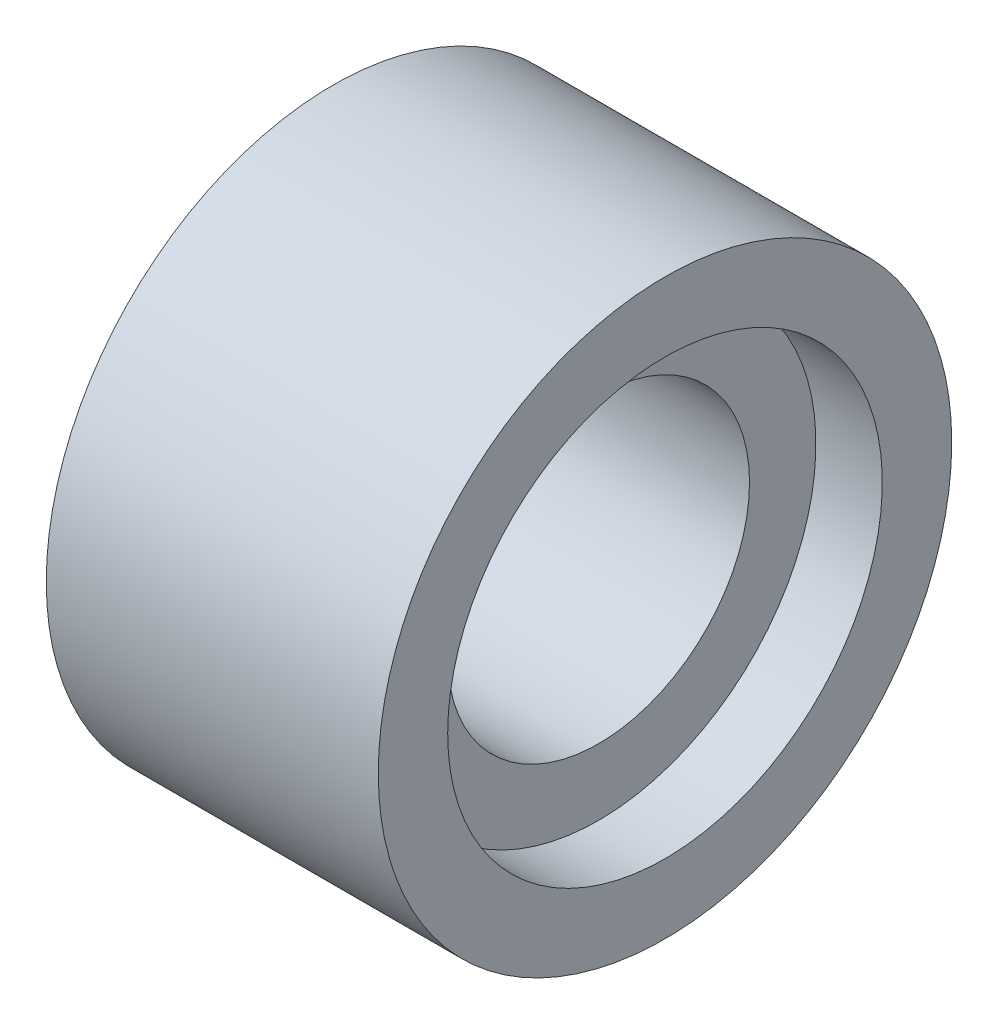
ISO-10303-21;
HEADER;
FILE_DESCRIPTION(('STEP AP214'),'2;1');
FILE_NAME('part.step','',(''),(''),'','','');
FILE_SCHEMA(('AUTOMOTIVE_DESIGN { 1 0 10303 214 1 1 1 1 }'));
ENDSEC;
DATA;
#1=APPLICATION_CONTEXT('core data for automotive mechanical design processes');
#2=APPLICATION_PROTOCOL_DEFINITION('international standard','automotive_design',2000,#1);
#3=PRODUCT_CONTEXT('',#1,'mechanical');
#4=PRODUCT('Part','Part','',(#3));
#5=PRODUCT_RELATED_PRODUCT_CATEGORY('part','',(#4));
#6=PRODUCT_DEFINITION_FORMATION('','',#4);
#7=PRODUCT_DEFINITION_CONTEXT('part definition',#1,'design');
#8=PRODUCT_DEFINITION('design','',#6,#7);
#9=PRODUCT_DEFINITION_SHAPE('','',#8);
#10=(LENGTH_UNIT() NAMED_UNIT(*) SI_UNIT(.MILLI.,.METRE.));
#11=(NAMED_UNIT(*) PLANE_ANGLE_UNIT() SI_UNIT($,.RADIAN.));
#12=(NAMED_UNIT(*) SI_UNIT($,.STERADIAN.) SOLID_ANGLE_UNIT());
#13=UNCERTAINTY_MEASURE_WITH_UNIT(LENGTH_MEASURE(1.E-05),#10,'distance_accuracy_value','');
#14=(GEOMETRIC_REPRESENTATION_CONTEXT(3) GLOBAL_UNCERTAINTY_ASSIGNED_CONTEXT((#13)) GLOBAL_UNIT_ASSIGNED_CONTEXT((#10,
#11,#12)) REPRESENTATION_CONTEXT('',''));
#15=CARTESIAN_POINT('',(0.,0.,0.));
#16=DIRECTION('',(0.,0.,1.));
#17=DIRECTION('',(1.,0.,0.));
#18=AXIS2_PLACEMENT_3D('',#15,#16,#17);
#19=CARTESIAN_POINT('',(-12.5747225647349,0.134147334147333,0.));
#20=DIRECTION('',(-1.,0.,0.));
#21=DIRECTION('',(0.,0.,1.));
#22=AXIS2_PLACEMENT_3D('',#19,#20,#21);
#23=CYLINDRICAL_SURFACE('',#22,9.5);
#24=CARTESIAN_POINT('',(0.,0.134147334147333,0.));
#25=DIRECTION('',(-1.,0.,0.));
#26=DIRECTION('',(0.,0.,1.));
#27=AXIS2_PLACEMENT_3D('',#24,#25,#26);
#28=CIRCLE('',#27,9.5);
#29=CARTESIAN_POINT('',(0.,0.134147334147333,9.5));
#30=VERTEX_POINT('',#29);
#31=EDGE_CURVE('E59',#30,#30,#28,.T.);
#32=ORIENTED_EDGE('',*,*,#31,.F.);
#33=EDGE_LOOP('',(#32));
#34=FACE_BOUND('',#33,.T.);
#35=CARTESIAN_POINT('',(11.,0.134147334147333,0.));
#36=DIRECTION('',(-1.,0.,0.));
#37=DIRECTION('',(0.,0.,1.));
#38=AXIS2_PLACEMENT_3D('',#35,#36,#37);
#39=CIRCLE('',#38,9.5);
#40=CARTESIAN_POINT('',(11.,0.134147334147333,9.5));
#41=VERTEX_POINT('',#40);
#42=EDGE_CURVE('E10',#41,#41,#39,.T.);
#43=ORIENTED_EDGE('',*,*,#42,.T.);
#44=EDGE_LOOP('',(#43));
#45=FACE_BOUND('',#44,.T.);
#46=ADVANCED_FACE('F31',(#34,#45),#23,.T.);
#47=CARTESIAN_POINT('',(11.,9.63414733414733,0.));
#48=DIRECTION('',(-1.,0.,0.));
#49=DIRECTION('',(0.,0.,1.));
#50=AXIS2_PLACEMENT_3D('',#47,#48,#49);
#51=PLANE('',#50);
#52=ORIENTED_EDGE('',*,*,#42,.F.);
#53=EDGE_LOOP('',(#52));
#54=FACE_BOUND('',#53,.T.);
#55=CARTESIAN_POINT('',(11.,0.134147334147333,0.));
#56=DIRECTION('',(-1.,0.,0.));
#57=DIRECTION('',(0.,0.,1.));
#58=AXIS2_PLACEMENT_3D('',#55,#56,#57);
#59=CIRCLE('',#58,7.2);
#60=CARTESIAN_POINT('',(11.,0.134147334147333,7.2));
#61=VERTEX_POINT('',#60);
#62=EDGE_CURVE('E37',#61,#61,#59,.T.);
#63=ORIENTED_EDGE('',*,*,#62,.T.);
#64=EDGE_LOOP('',(#63));
#65=FACE_BOUND('',#64,.T.);
#66=ADVANCED_FACE('F66',(#54,#65),#51,.F.);
#67=CARTESIAN_POINT('',(-12.5747225647349,0.134147334147333,0.));
#68=DIRECTION('',(-1.,0.,0.));
#69=DIRECTION('',(0.,0.,1.));
#70=AXIS2_PLACEMENT_3D('',#67,#68,#69);
#71=CYLINDRICAL_SURFACE('',#70,7.2);
#72=ORIENTED_EDGE('',*,*,#62,.F.);
#73=EDGE_LOOP('',(#72));
#74=FACE_BOUND('',#73,.T.);
#75=CARTESIAN_POINT('',(8.8,0.134147334147333,0.));
#76=DIRECTION('',(-1.,0.,0.));
#77=DIRECTION('',(0.,0.,1.));
#78=AXIS2_PLACEMENT_3D('',#75,#76,#77);
#79=CIRCLE('',#78,7.2);
#80=CARTESIAN_POINT('',(8.8,0.134147334147333,7.2));
#81=VERTEX_POINT('',#80);
#82=EDGE_CURVE('E41',#81,#81,#79,.T.);
#83=ORIENTED_EDGE('',*,*,#82,.T.);
#84=EDGE_LOOP('',(#83));
#85=FACE_BOUND('',#84,.T.);
#86=ADVANCED_FACE('F70',(#74,#85),#71,.F.);
#87=CARTESIAN_POINT('',(8.8,5.13414733414733,0.));
#88=DIRECTION('',(-1.,0.,0.));
#89=DIRECTION('',(0.,0.,1.));
#90=AXIS2_PLACEMENT_3D('',#87,#88,#89);
#91=PLANE('',#90);
#92=ORIENTED_EDGE('',*,*,#82,.F.);
#93=EDGE_LOOP('',(#92));
#94=FACE_BOUND('',#93,.T.);
#95=CARTESIAN_POINT('',(8.8,0.134147334147333,0.));
#96=DIRECTION('',(-1.,0.,0.));
#97=DIRECTION('',(0.,0.,1.));
#98=AXIS2_PLACEMENT_3D('',#95,#96,#97);
#99=CIRCLE('',#98,5.);
#100=CARTESIAN_POINT('',(8.8,0.134147334147333,5.));
#101=VERTEX_POINT('',#100);
#102=EDGE_CURVE('E45',#101,#101,#99,.T.);
#103=ORIENTED_EDGE('',*,*,#102,.T.);
#104=EDGE_LOOP('',(#103));
#105=FACE_BOUND('',#104,.T.);
#106=ADVANCED_FACE('F75',(#94,#105),#91,.F.);
#107=CARTESIAN_POINT('',(-12.5747225647349,0.134147334147333,0.));
#108=DIRECTION('',(-1.,0.,0.));
#109=DIRECTION('',(0.,0.,1.));
#110=AXIS2_PLACEMENT_3D('',#107,#108,#109);
#111=CYLINDRICAL_SURFACE('',#110,5.);
#112=ORIENTED_EDGE('',*,*,#102,.F.);
#113=EDGE_LOOP('',(#112));
#114=FACE_BOUND('',#113,.T.);
#115=CARTESIAN_POINT('',(2.2,0.134147334147333,0.));
#116=DIRECTION('',(-1.,0.,0.));
#117=DIRECTION('',(0.,0.,1.));
#118=AXIS2_PLACEMENT_3D('',#115,#116,#117);
#119=CIRCLE('',#118,5.);
#120=CARTESIAN_POINT('',(2.2,0.134147334147333,5.));
#121=VERTEX_POINT('',#120);
#122=EDGE_CURVE('E50',#121,#121,#119,.T.);
#123=ORIENTED_EDGE('',*,*,#122,.T.);
#124=EDGE_LOOP('',(#123));
#125=FACE_BOUND('',#124,.T.);
#126=ADVANCED_FACE('F81',(#114,#125),#111,.F.);
#127=CARTESIAN_POINT('',(2.2,7.33414733414733,0.));
#128=DIRECTION('',(1.,0.,0.));
#129=DIRECTION('',(0.,0.,-1.));
#130=AXIS2_PLACEMENT_3D('',#127,#128,#129);
#131=PLANE('',#130);
#132=ORIENTED_EDGE('',*,*,#122,.F.);
#133=EDGE_LOOP('',(#132));
#134=FACE_BOUND('',#133,.T.);
#135=CARTESIAN_POINT('',(2.2,0.134147334147333,0.));
#136=DIRECTION('',(-1.,0.,0.));
#137=DIRECTION('',(0.,0.,1.));
#138=AXIS2_PLACEMENT_3D('',#135,#136,#137);
#139=CIRCLE('',#138,7.2);
#140=CARTESIAN_POINT('',(2.2,0.134147334147333,7.2));
#141=VERTEX_POINT('',#140);
#142=EDGE_CURVE('E53',#141,#141,#139,.T.);
#143=ORIENTED_EDGE('',*,*,#142,.T.);
#144=EDGE_LOOP('',(#143));
#145=FACE_BOUND('',#144,.T.);
#146=ADVANCED_FACE('F85',(#134,#145),#131,.F.);
#147=CARTESIAN_POINT('',(-12.5747225647349,0.134147334147333,0.));
#148=DIRECTION('',(-1.,0.,0.));
#149=DIRECTION('',(0.,0.,1.));
#150=AXIS2_PLACEMENT_3D('',#147,#148,#149);
#151=CYLINDRICAL_SURFACE('',#150,7.2);
#152=ORIENTED_EDGE('',*,*,#142,.F.);
#153=EDGE_LOOP('',(#152));
#154=FACE_BOUND('',#153,.T.);
#155=CARTESIAN_POINT('',(0.,0.134147334147333,0.));
#156=DIRECTION('',(-1.,0.,0.));
#157=DIRECTION('',(0.,0.,1.));
#158=AXIS2_PLACEMENT_3D('',#155,#156,#157);
#159=CIRCLE('',#158,7.2);
#160=CARTESIAN_POINT('',(0.,0.134147334147333,7.2));
#161=VERTEX_POINT('',#160);
#162=EDGE_CURVE('E56',#161,#161,#159,.T.);
#163=ORIENTED_EDGE('',*,*,#162,.T.);
#164=EDGE_LOOP('',(#163));
#165=FACE_BOUND('',#164,.T.);
#166=ADVANCED_FACE('F89',(#154,#165),#151,.F.);
#167=CARTESIAN_POINT('',(0.,7.33414733414733,0.));
#168=DIRECTION('',(1.,0.,0.));
#169=DIRECTION('',(0.,0.,-1.));
#170=AXIS2_PLACEMENT_3D('',#167,#168,#169);
#171=PLANE('',#170);
#172=ORIENTED_EDGE('',*,*,#162,.F.);
#173=EDGE_LOOP('',(#172));
#174=FACE_BOUND('',#173,.T.);
#175=ORIENTED_EDGE('',*,*,#31,.T.);
#176=EDGE_LOOP('',(#175));
#177=FACE_BOUND('',#176,.T.);
#178=ADVANCED_FACE('F63',(#174,#177),#171,.F.);
#179=CLOSED_SHELL('',(#46,#66,#86,#106,#126,#146,#166,#178));
#180=MANIFOLD_SOLID_BREP('B2',#179);
#181=ADVANCED_BREP_SHAPE_REPRESENTATION('',(#18,#180),#14);
#182=SHAPE_DEFINITION_REPRESENTATION(#9,#181);
ENDSEC;
END-ISO-10303-21;
